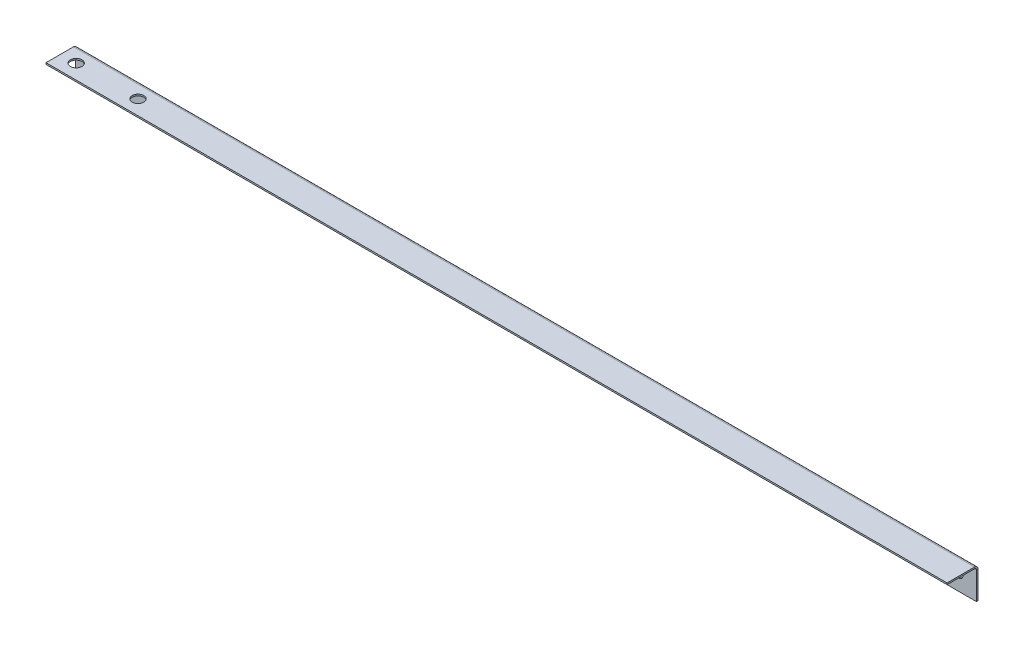
ISO-10303-21;
HEADER;
FILE_DESCRIPTION(('STEP AP214'),'2;1');
FILE_NAME('part.step','',(''),(''),'','','');
FILE_SCHEMA(('AUTOMOTIVE_DESIGN { 1 0 10303 214 1 1 1 1 }'));
ENDSEC;
DATA;
#1=APPLICATION_CONTEXT('core data for automotive mechanical design processes');
#2=APPLICATION_PROTOCOL_DEFINITION('international standard','automotive_design',2000,#1);
#3=PRODUCT_CONTEXT('',#1,'mechanical');
#4=PRODUCT('Part','Part','',(#3));
#5=PRODUCT_RELATED_PRODUCT_CATEGORY('part','',(#4));
#6=PRODUCT_DEFINITION_FORMATION('','',#4);
#7=PRODUCT_DEFINITION_CONTEXT('part definition',#1,'design');
#8=PRODUCT_DEFINITION('design','',#6,#7);
#9=PRODUCT_DEFINITION_SHAPE('','',#8);
#10=(LENGTH_UNIT() NAMED_UNIT(*) SI_UNIT(.MILLI.,.METRE.));
#11=(NAMED_UNIT(*) PLANE_ANGLE_UNIT() SI_UNIT($,.RADIAN.));
#12=(NAMED_UNIT(*) SI_UNIT($,.STERADIAN.) SOLID_ANGLE_UNIT());
#13=UNCERTAINTY_MEASURE_WITH_UNIT(LENGTH_MEASURE(1.E-05),#10,'distance_accuracy_value','');
#14=(GEOMETRIC_REPRESENTATION_CONTEXT(3) GLOBAL_UNCERTAINTY_ASSIGNED_CONTEXT((#13)) GLOBAL_UNIT_ASSIGNED_CONTEXT((#10,
#11,#12)) REPRESENTATION_CONTEXT('',''));
#15=CARTESIAN_POINT('',(0.,0.,0.));
#16=DIRECTION('',(0.,0.,1.));
#17=DIRECTION('',(1.,0.,0.));
#18=AXIS2_PLACEMENT_3D('',#15,#16,#17);
#19=CARTESIAN_POINT('',(-667.944287729196,82.8577402699223,-2.));
#20=DIRECTION('',(-1.,0.,0.));
#21=DIRECTION('',(0.,0.,1.));
#22=AXIS2_PLACEMENT_3D('',#19,#20,#21);
#23=PLANE('',#22);
#24=DIRECTION('',(0.,-1.,0.));
#25=VECTOR('',#24,1.);
#26=CARTESIAN_POINT('',(-667.944287729196,82.8577402699223,0.));
#27=LINE('',#26,#25);
#28=CARTESIAN_POINT('',(-667.944287729196,78.3577402699223,0.));
#29=VERTEX_POINT('',#28);
#30=CARTESIAN_POINT('',(-667.944287729196,42.8577402699223,0.));
#31=VERTEX_POINT('',#30);
#32=EDGE_CURVE('E308',#29,#31,#27,.T.);
#33=ORIENTED_EDGE('',*,*,#32,.F.);
#34=DIRECTION('',(0.,0.,-1.));
#35=VECTOR('',#34,1.);
#36=CARTESIAN_POINT('',(-667.944287729196,78.3577402699223,0.));
#37=LINE('',#36,#35);
#38=CARTESIAN_POINT('',(-667.944287729196,78.3577402699222,-2.));
#39=VERTEX_POINT('',#38);
#40=EDGE_CURVE('E224',#29,#39,#37,.T.);
#41=ORIENTED_EDGE('',*,*,#40,.T.);
#42=DIRECTION('',(0.,-1.,0.));
#43=VECTOR('',#42,1.);
#44=CARTESIAN_POINT('',(-667.944287729196,82.8577402699223,-2.));
#45=LINE('',#44,#43);
#46=CARTESIAN_POINT('',(-667.944287729196,42.8577402699223,-2.));
#47=VERTEX_POINT('',#46);
#48=EDGE_CURVE('E300',#39,#47,#45,.T.);
#49=ORIENTED_EDGE('',*,*,#48,.T.);
#50=DIRECTION('',(0.,0.,1.));
#51=VECTOR('',#50,1.);
#52=CARTESIAN_POINT('',(-667.944287729196,42.8577402699223,-2.));
#53=LINE('',#52,#51);
#54=EDGE_CURVE('E62',#47,#31,#53,.T.);
#55=ORIENTED_EDGE('',*,*,#54,.T.);
#56=EDGE_LOOP('',(#33,#41,#49,#55));
#57=FACE_BOUND('',#56,.T.);
#58=ADVANCED_FACE('F58',(#57),#23,.T.);
#59=CARTESIAN_POINT('',(0.,0.,-2.));
#60=DIRECTION('',(0.,0.,-1.));
#61=DIRECTION('',(-1.,0.,0.));
#62=AXIS2_PLACEMENT_3D('',#59,#60,#61);
#63=PLANE('',#62);
#64=CARTESIAN_POINT('',(374.555712270804,62.8577402699224,-2.));
#65=DIRECTION('',(0.,0.,1.));
#66=DIRECTION('',(1.,0.,0.));
#67=AXIS2_PLACEMENT_3D('',#64,#65,#66);
#68=CIRCLE('',#67,4.99999999999999);
#69=CARTESIAN_POINT('',(374.555712270804,57.8577402699224,-2.));
#70=VERTEX_POINT('',#69);
#71=CARTESIAN_POINT('',(374.555712270804,67.8577402699224,-2.));
#72=VERTEX_POINT('',#71);
#73=EDGE_CURVE('E235',#70,#72,#68,.T.);
#74=ORIENTED_EDGE('',*,*,#73,.T.);
#75=DIRECTION('',(-1.,0.,0.));
#76=VECTOR('',#75,1.);
#77=CARTESIAN_POINT('',(374.555712270804,67.8577402699224,-2.));
#78=LINE('',#77,#76);
#79=CARTESIAN_POINT('',(359.555712270804,67.8577402699224,-2.));
#80=VERTEX_POINT('',#79);
#81=EDGE_CURVE('E238',#72,#80,#78,.T.);
#82=ORIENTED_EDGE('',*,*,#81,.T.);
#83=CARTESIAN_POINT('',(359.555712270804,62.8577402699224,-2.));
#84=DIRECTION('',(0.,0.,1.));
#85=DIRECTION('',(1.,0.,0.));
#86=AXIS2_PLACEMENT_3D('',#83,#84,#85);
#87=CIRCLE('',#86,5.);
#88=CARTESIAN_POINT('',(359.555712270804,57.8577402699224,-2.));
#89=VERTEX_POINT('',#88);
#90=EDGE_CURVE('E81',#80,#89,#87,.T.);
#91=ORIENTED_EDGE('',*,*,#90,.T.);
#92=DIRECTION('',(1.,0.,0.));
#93=VECTOR('',#92,1.);
#94=CARTESIAN_POINT('',(374.555712270804,57.8577402699224,-2.));
#95=LINE('',#94,#93);
#96=EDGE_CURVE('E243',#89,#70,#95,.T.);
#97=ORIENTED_EDGE('',*,*,#96,.T.);
#98=EDGE_LOOP('',(#74,#82,#91,#97));
#99=FACE_BOUND('',#98,.T.);
#100=CARTESIAN_POINT('',(474.555712270804,62.8577402699224,-2.));
#101=DIRECTION('',(0.,0.,1.));
#102=DIRECTION('',(1.,0.,0.));
#103=AXIS2_PLACEMENT_3D('',#100,#101,#102);
#104=CIRCLE('',#103,5.);
#105=CARTESIAN_POINT('',(474.555712270804,57.8577402699224,-2.));
#106=VERTEX_POINT('',#105);
#107=CARTESIAN_POINT('',(474.555712270804,67.8577402699224,-2.));
#108=VERTEX_POINT('',#107);
#109=EDGE_CURVE('E265',#106,#108,#104,.T.);
#110=ORIENTED_EDGE('',*,*,#109,.T.);
#111=DIRECTION('',(-1.,0.,0.));
#112=VECTOR('',#111,1.);
#113=CARTESIAN_POINT('',(474.555712270804,67.8577402699224,-2.));
#114=LINE('',#113,#112);
#115=CARTESIAN_POINT('',(459.555712270804,67.8577402699224,-2.));
#116=VERTEX_POINT('',#115);
#117=EDGE_CURVE('E268',#108,#116,#114,.T.);
#118=ORIENTED_EDGE('',*,*,#117,.T.);
#119=CARTESIAN_POINT('',(459.555712270804,62.8577402699224,-2.));
#120=DIRECTION('',(0.,0.,1.));
#121=DIRECTION('',(1.,0.,0.));
#122=AXIS2_PLACEMENT_3D('',#119,#120,#121);
#123=CIRCLE('',#122,5.);
#124=CARTESIAN_POINT('',(459.555712270804,57.8577402699224,-2.));
#125=VERTEX_POINT('',#124);
#126=EDGE_CURVE('E272',#116,#125,#123,.T.);
#127=ORIENTED_EDGE('',*,*,#126,.T.);
#128=DIRECTION('',(1.,0.,0.));
#129=VECTOR('',#128,1.);
#130=CARTESIAN_POINT('',(474.555712270804,57.8577402699224,-2.));
#131=LINE('',#130,#129);
#132=EDGE_CURVE('E275',#125,#106,#131,.T.);
#133=ORIENTED_EDGE('',*,*,#132,.T.);
#134=EDGE_LOOP('',(#110,#118,#127,#133));
#135=FACE_BOUND('',#134,.T.);
#136=ORIENTED_EDGE('',*,*,#48,.F.);
#137=DIRECTION('',(-1.,0.,0.));
#138=VECTOR('',#137,1.);
#139=CARTESIAN_POINT('',(-667.944287729196,78.3577402699222,-2.));
#140=LINE('',#139,#138);
#141=CARTESIAN_POINT('',(497.055712270804,78.3577402699223,-2.));
#142=VERTEX_POINT('',#141);
#143=EDGE_CURVE('E174',#39,#142,#140,.F.);
#144=ORIENTED_EDGE('',*,*,#143,.T.);
#145=DIRECTION('',(0.,1.,0.));
#146=VECTOR('',#145,1.);
#147=CARTESIAN_POINT('',(497.055712270804,82.8577402699224,-2.));
#148=LINE('',#147,#146);
#149=CARTESIAN_POINT('',(497.055712270804,42.8577402699224,-2.));
#150=VERTEX_POINT('',#149);
#151=EDGE_CURVE('E297',#150,#142,#148,.T.);
#152=ORIENTED_EDGE('',*,*,#151,.F.);
#153=DIRECTION('',(1.,0.,0.));
#154=VECTOR('',#153,1.);
#155=CARTESIAN_POINT('',(497.055712270804,42.8577402699224,-2.));
#156=LINE('',#155,#154);
#157=EDGE_CURVE('E303',#47,#150,#156,.T.);
#158=ORIENTED_EDGE('',*,*,#157,.F.);
#159=EDGE_LOOP('',(#136,#144,#152,#158));
#160=FACE_BOUND('',#159,.T.);
#161=ADVANCED_FACE('F330',(#99,#135,#160),#63,.T.);
#162=CARTESIAN_POINT('',(0.,0.,0.));
#163=DIRECTION('',(0.,0.,-1.));
#164=DIRECTION('',(-1.,0.,0.));
#165=AXIS2_PLACEMENT_3D('',#162,#163,#164);
#166=PLANE('',#165);
#167=DIRECTION('',(-1.,0.,0.));
#168=VECTOR('',#167,1.);
#169=CARTESIAN_POINT('',(474.555712270804,67.8577402699224,0.));
#170=LINE('',#169,#168);
#171=CARTESIAN_POINT('',(474.555712270804,67.8577402699224,0.));
#172=VERTEX_POINT('',#171);
#173=CARTESIAN_POINT('',(459.555712270804,67.8577402699224,0.));
#174=VERTEX_POINT('',#173);
#175=EDGE_CURVE('E280',#172,#174,#170,.T.);
#176=ORIENTED_EDGE('',*,*,#175,.F.);
#177=CARTESIAN_POINT('',(474.555712270804,62.8577402699224,0.));
#178=DIRECTION('',(0.,0.,1.));
#179=DIRECTION('',(1.,0.,0.));
#180=AXIS2_PLACEMENT_3D('',#177,#178,#179);
#181=CIRCLE('',#180,5.);
#182=CARTESIAN_POINT('',(474.555712270804,57.8577402699224,0.));
#183=VERTEX_POINT('',#182);
#184=EDGE_CURVE('E258',#183,#172,#181,.T.);
#185=ORIENTED_EDGE('',*,*,#184,.F.);
#186=DIRECTION('',(1.,0.,0.));
#187=VECTOR('',#186,1.);
#188=CARTESIAN_POINT('',(474.555712270804,57.8577402699224,0.));
#189=LINE('',#188,#187);
#190=CARTESIAN_POINT('',(459.555712270804,57.8577402699224,0.));
#191=VERTEX_POINT('',#190);
#192=EDGE_CURVE('E269',#191,#183,#189,.T.);
#193=ORIENTED_EDGE('',*,*,#192,.F.);
#194=CARTESIAN_POINT('',(459.555712270804,62.8577402699224,0.));
#195=DIRECTION('',(0.,0.,1.));
#196=DIRECTION('',(1.,0.,0.));
#197=AXIS2_PLACEMENT_3D('',#194,#195,#196);
#198=CIRCLE('',#197,5.);
#199=EDGE_CURVE('E283',#174,#191,#198,.T.);
#200=ORIENTED_EDGE('',*,*,#199,.F.);
#201=EDGE_LOOP('',(#176,#185,#193,#200));
#202=FACE_BOUND('',#201,.T.);
#203=DIRECTION('',(-1.,0.,0.));
#204=VECTOR('',#203,1.);
#205=CARTESIAN_POINT('',(374.555712270804,67.8577402699224,0.));
#206=LINE('',#205,#204);
#207=CARTESIAN_POINT('',(374.555712270804,67.8577402699224,0.));
#208=VERTEX_POINT('',#207);
#209=CARTESIAN_POINT('',(359.555712270804,67.8577402699224,0.));
#210=VERTEX_POINT('',#209);
#211=EDGE_CURVE('E248',#208,#210,#206,.T.);
#212=ORIENTED_EDGE('',*,*,#211,.F.);
#213=CARTESIAN_POINT('',(374.555712270804,62.8577402699224,0.));
#214=DIRECTION('',(0.,0.,1.));
#215=DIRECTION('',(1.,0.,0.));
#216=AXIS2_PLACEMENT_3D('',#213,#214,#215);
#217=CIRCLE('',#216,4.99999999999999);
#218=CARTESIAN_POINT('',(374.555712270804,57.8577402699224,0.));
#219=VERTEX_POINT('',#218);
#220=EDGE_CURVE('E233',#219,#208,#217,.T.);
#221=ORIENTED_EDGE('',*,*,#220,.F.);
#222=DIRECTION('',(1.,0.,0.));
#223=VECTOR('',#222,1.);
#224=CARTESIAN_POINT('',(374.555712270804,57.8577402699224,0.));
#225=LINE('',#224,#223);
#226=CARTESIAN_POINT('',(359.555712270804,57.8577402699224,0.));
#227=VERTEX_POINT('',#226);
#228=EDGE_CURVE('E239',#227,#219,#225,.T.);
#229=ORIENTED_EDGE('',*,*,#228,.F.);
#230=CARTESIAN_POINT('',(359.555712270804,62.8577402699224,0.));
#231=DIRECTION('',(0.,0.,1.));
#232=DIRECTION('',(1.,0.,0.));
#233=AXIS2_PLACEMENT_3D('',#230,#231,#232);
#234=CIRCLE('',#233,5.);
#235=EDGE_CURVE('E251',#210,#227,#234,.T.);
#236=ORIENTED_EDGE('',*,*,#235,.F.);
#237=EDGE_LOOP('',(#212,#221,#229,#236));
#238=FACE_BOUND('',#237,.T.);
#239=DIRECTION('',(-1.,0.,0.));
#240=VECTOR('',#239,1.);
#241=CARTESIAN_POINT('',(-667.944287729196,78.3577402699223,0.));
#242=LINE('',#241,#240);
#243=CARTESIAN_POINT('',(497.055712270804,78.3577402699223,0.));
#244=VERTEX_POINT('',#243);
#245=EDGE_CURVE('E228',#29,#244,#242,.F.);
#246=ORIENTED_EDGE('',*,*,#245,.F.);
#247=ORIENTED_EDGE('',*,*,#32,.T.);
#248=DIRECTION('',(1.,0.,0.));
#249=VECTOR('',#248,1.);
#250=CARTESIAN_POINT('',(497.055712270804,42.8577402699224,0.));
#251=LINE('',#250,#249);
#252=CARTESIAN_POINT('',(497.055712270804,42.8577402699224,0.));
#253=VERTEX_POINT('',#252);
#254=EDGE_CURVE('E301',#31,#253,#251,.T.);
#255=ORIENTED_EDGE('',*,*,#254,.T.);
#256=DIRECTION('',(0.,1.,0.));
#257=VECTOR('',#256,1.);
#258=CARTESIAN_POINT('',(497.055712270804,82.8577402699224,0.));
#259=LINE('',#258,#257);
#260=EDGE_CURVE('E290',#253,#244,#259,.T.);
#261=ORIENTED_EDGE('',*,*,#260,.T.);
#262=EDGE_LOOP('',(#246,#247,#255,#261));
#263=FACE_BOUND('',#262,.T.);
#264=ADVANCED_FACE('F314',(#202,#238,#263),#166,.F.);
#265=CARTESIAN_POINT('',(497.055712270804,82.8577402699224,-2.));
#266=DIRECTION('',(1.,0.,0.));
#267=DIRECTION('',(0.,0.,-1.));
#268=AXIS2_PLACEMENT_3D('',#265,#266,#267);
#269=PLANE('',#268);
#270=DIRECTION('',(0.,0.,-1.));
#271=VECTOR('',#270,1.);
#272=CARTESIAN_POINT('',(497.055712270804,78.3577402699223,0.));
#273=LINE('',#272,#271);
#274=EDGE_CURVE('E231',#244,#142,#273,.T.);
#275=ORIENTED_EDGE('',*,*,#274,.F.);
#276=ORIENTED_EDGE('',*,*,#260,.F.);
#277=DIRECTION('',(0.,0.,1.));
#278=VECTOR('',#277,1.);
#279=CARTESIAN_POINT('',(497.055712270804,42.8577402699224,-2.));
#280=LINE('',#279,#278);
#281=EDGE_CURVE('E13',#150,#253,#280,.T.);
#282=ORIENTED_EDGE('',*,*,#281,.F.);
#283=ORIENTED_EDGE('',*,*,#151,.T.);
#284=EDGE_LOOP('',(#275,#276,#282,#283));
#285=FACE_BOUND('',#284,.T.);
#286=ADVANCED_FACE('F60',(#285),#269,.T.);
#287=CARTESIAN_POINT('',(497.055712270804,42.8577402699224,-2.));
#288=DIRECTION('',(0.,-1.,0.));
#289=DIRECTION('',(1.,0.,0.));
#290=AXIS2_PLACEMENT_3D('',#287,#288,#289);
#291=PLANE('',#290);
#292=ORIENTED_EDGE('',*,*,#254,.F.);
#293=ORIENTED_EDGE('',*,*,#54,.F.);
#294=ORIENTED_EDGE('',*,*,#157,.T.);
#295=ORIENTED_EDGE('',*,*,#281,.T.);
#296=EDGE_LOOP('',(#292,#293,#294,#295));
#297=FACE_BOUND('',#296,.T.);
#298=ADVANCED_FACE('F321',(#297),#291,.T.);
#299=CARTESIAN_POINT('',(474.555712270804,62.8577402699224,-2.));
#300=DIRECTION('',(0.,0.,1.));
#301=DIRECTION('',(1.,0.,0.));
#302=AXIS2_PLACEMENT_3D('',#299,#300,#301);
#303=CYLINDRICAL_SURFACE('',#302,5.);
#304=ORIENTED_EDGE('',*,*,#184,.T.);
#305=DIRECTION('',(0.,0.,1.));
#306=VECTOR('',#305,1.);
#307=CARTESIAN_POINT('',(474.555712270804,67.8577402699224,-2.));
#308=LINE('',#307,#306);
#309=EDGE_CURVE('E278',#108,#172,#308,.T.);
#310=ORIENTED_EDGE('',*,*,#309,.F.);
#311=ORIENTED_EDGE('',*,*,#109,.F.);
#312=DIRECTION('',(0.,0.,1.));
#313=VECTOR('',#312,1.);
#314=CARTESIAN_POINT('',(474.555712270804,57.8577402699224,-2.));
#315=LINE('',#314,#313);
#316=EDGE_CURVE('E288',#106,#183,#315,.T.);
#317=ORIENTED_EDGE('',*,*,#316,.T.);
#318=EDGE_LOOP('',(#304,#310,#311,#317));
#319=FACE_BOUND('',#318,.T.);
#320=ADVANCED_FACE('F389',(#319),#303,.F.);
#321=CARTESIAN_POINT('',(474.555712270804,57.8577402699224,-2.));
#322=DIRECTION('',(0.,-1.,0.));
#323=DIRECTION('',(1.,0.,0.));
#324=AXIS2_PLACEMENT_3D('',#321,#322,#323);
#325=PLANE('',#324);
#326=ORIENTED_EDGE('',*,*,#192,.T.);
#327=ORIENTED_EDGE('',*,*,#316,.F.);
#328=ORIENTED_EDGE('',*,*,#132,.F.);
#329=DIRECTION('',(0.,0.,1.));
#330=VECTOR('',#329,1.);
#331=CARTESIAN_POINT('',(459.555712270804,57.8577402699224,-2.));
#332=LINE('',#331,#330);
#333=EDGE_CURVE('E291',#125,#191,#332,.T.);
#334=ORIENTED_EDGE('',*,*,#333,.T.);
#335=EDGE_LOOP('',(#326,#327,#328,#334));
#336=FACE_BOUND('',#335,.T.);
#337=ADVANCED_FACE('F395',(#336),#325,.F.);
#338=CARTESIAN_POINT('',(459.555712270804,62.8577402699224,-2.));
#339=DIRECTION('',(0.,0.,1.));
#340=DIRECTION('',(1.,0.,0.));
#341=AXIS2_PLACEMENT_3D('',#338,#339,#340);
#342=CYLINDRICAL_SURFACE('',#341,5.);
#343=ORIENTED_EDGE('',*,*,#199,.T.);
#344=ORIENTED_EDGE('',*,*,#333,.F.);
#345=ORIENTED_EDGE('',*,*,#126,.F.);
#346=DIRECTION('',(0.,0.,1.));
#347=VECTOR('',#346,1.);
#348=CARTESIAN_POINT('',(459.555712270804,67.8577402699224,-2.));
#349=LINE('',#348,#347);
#350=EDGE_CURVE('E293',#116,#174,#349,.T.);
#351=ORIENTED_EDGE('',*,*,#350,.T.);
#352=EDGE_LOOP('',(#343,#344,#345,#351));
#353=FACE_BOUND('',#352,.T.);
#354=ADVANCED_FACE('F401',(#353),#342,.F.);
#355=CARTESIAN_POINT('',(474.555712270804,67.8577402699224,-2.));
#356=DIRECTION('',(0.,1.,0.));
#357=DIRECTION('',(0.,0.,1.));
#358=AXIS2_PLACEMENT_3D('',#355,#356,#357);
#359=PLANE('',#358);
#360=ORIENTED_EDGE('',*,*,#175,.T.);
#361=ORIENTED_EDGE('',*,*,#350,.F.);
#362=ORIENTED_EDGE('',*,*,#117,.F.);
#363=ORIENTED_EDGE('',*,*,#309,.T.);
#364=EDGE_LOOP('',(#360,#361,#362,#363));
#365=FACE_BOUND('',#364,.T.);
#366=ADVANCED_FACE('F397',(#365),#359,.F.);
#367=CARTESIAN_POINT('',(374.555712270804,62.8577402699224,-2.));
#368=DIRECTION('',(0.,0.,1.));
#369=DIRECTION('',(1.,0.,0.));
#370=AXIS2_PLACEMENT_3D('',#367,#368,#369);
#371=CYLINDRICAL_SURFACE('',#370,4.99999999999999);
#372=ORIENTED_EDGE('',*,*,#220,.T.);
#373=DIRECTION('',(0.,0.,1.));
#374=VECTOR('',#373,1.);
#375=CARTESIAN_POINT('',(374.555712270804,67.8577402699224,-2.));
#376=LINE('',#375,#374);
#377=EDGE_CURVE('E246',#72,#208,#376,.T.);
#378=ORIENTED_EDGE('',*,*,#377,.F.);
#379=ORIENTED_EDGE('',*,*,#73,.F.);
#380=DIRECTION('',(0.,0.,1.));
#381=VECTOR('',#380,1.);
#382=CARTESIAN_POINT('',(374.555712270804,57.8577402699224,-2.));
#383=LINE('',#382,#381);
#384=EDGE_CURVE('E256',#70,#219,#383,.T.);
#385=ORIENTED_EDGE('',*,*,#384,.T.);
#386=EDGE_LOOP('',(#372,#378,#379,#385));
#387=FACE_BOUND('',#386,.T.);
#388=ADVANCED_FACE('F400',(#387),#371,.F.);
#389=CARTESIAN_POINT('',(374.555712270804,57.8577402699224,-2.));
#390=DIRECTION('',(0.,-1.,0.));
#391=DIRECTION('',(1.,0.,0.));
#392=AXIS2_PLACEMENT_3D('',#389,#390,#391);
#393=PLANE('',#392);
#394=ORIENTED_EDGE('',*,*,#228,.T.);
#395=ORIENTED_EDGE('',*,*,#384,.F.);
#396=ORIENTED_EDGE('',*,*,#96,.F.);
#397=DIRECTION('',(0.,0.,1.));
#398=VECTOR('',#397,1.);
#399=CARTESIAN_POINT('',(359.555712270804,57.8577402699224,-2.));
#400=LINE('',#399,#398);
#401=EDGE_CURVE('E259',#89,#227,#400,.T.);
#402=ORIENTED_EDGE('',*,*,#401,.T.);
#403=EDGE_LOOP('',(#394,#395,#396,#402));
#404=FACE_BOUND('',#403,.T.);
#405=ADVANCED_FACE('F411',(#404),#393,.F.);
#406=CARTESIAN_POINT('',(359.555712270804,62.8577402699224,-2.));
#407=DIRECTION('',(0.,0.,1.));
#408=DIRECTION('',(1.,0.,0.));
#409=AXIS2_PLACEMENT_3D('',#406,#407,#408);
#410=CYLINDRICAL_SURFACE('',#409,5.);
#411=ORIENTED_EDGE('',*,*,#235,.T.);
#412=ORIENTED_EDGE('',*,*,#401,.F.);
#413=ORIENTED_EDGE('',*,*,#90,.F.);
#414=DIRECTION('',(0.,0.,1.));
#415=VECTOR('',#414,1.);
#416=CARTESIAN_POINT('',(359.555712270804,67.8577402699224,-2.));
#417=LINE('',#416,#415);
#418=EDGE_CURVE('E261',#80,#210,#417,.T.);
#419=ORIENTED_EDGE('',*,*,#418,.T.);
#420=EDGE_LOOP('',(#411,#412,#413,#419));
#421=FACE_BOUND('',#420,.T.);
#422=ADVANCED_FACE('F416',(#421),#410,.F.);
#423=CARTESIAN_POINT('',(374.555712270804,67.8577402699224,-2.));
#424=DIRECTION('',(0.,1.,0.));
#425=DIRECTION('',(0.,0.,1.));
#426=AXIS2_PLACEMENT_3D('',#423,#424,#425);
#427=PLANE('',#426);
#428=ORIENTED_EDGE('',*,*,#211,.T.);
#429=ORIENTED_EDGE('',*,*,#418,.F.);
#430=ORIENTED_EDGE('',*,*,#81,.F.);
#431=ORIENTED_EDGE('',*,*,#377,.T.);
#432=EDGE_LOOP('',(#428,#429,#430,#431));
#433=FACE_BOUND('',#432,.T.);
#434=ADVANCED_FACE('F413',(#433),#427,.F.);
#435=CARTESIAN_POINT('',(497.055712270804,78.3577402699224,2.49999999999997));
#436=DIRECTION('',(1.,0.,0.));
#437=DIRECTION('',(0.,0.,-1.));
#438=AXIS2_PLACEMENT_3D('',#435,#436,#437);
#439=PLANE('',#438);
#440=DIRECTION('',(0.,1.,0.));
#441=VECTOR('',#440,1.);
#442=CARTESIAN_POINT('',(497.055712270804,82.8577402699224,2.49999999999998));
#443=LINE('',#442,#441);
#444=CARTESIAN_POINT('',(497.055712270804,80.8577402699224,2.49999999999997));
#445=VERTEX_POINT('',#444);
#446=CARTESIAN_POINT('',(497.055712270804,82.8577402699224,2.49999999999996));
#447=VERTEX_POINT('',#446);
#448=EDGE_CURVE('E219',#445,#447,#443,.T.);
#449=ORIENTED_EDGE('',*,*,#448,.F.);
#450=CARTESIAN_POINT('',(497.055712270804,78.3577402699224,2.49999999999997));
#451=DIRECTION('',(-1.,0.,0.));
#452=DIRECTION('',(0.,0.,1.));
#453=AXIS2_PLACEMENT_3D('',#450,#451,#452);
#454=CIRCLE('',#453,2.50000000000007);
#455=EDGE_CURVE('E177',#244,#445,#454,.F.);
#456=ORIENTED_EDGE('',*,*,#455,.F.);
#457=ORIENTED_EDGE('',*,*,#274,.T.);
#458=CARTESIAN_POINT('',(497.055712270804,78.3577402699224,2.49999999999997));
#459=DIRECTION('',(-1.,0.,0.));
#460=DIRECTION('',(0.,0.,1.));
#461=AXIS2_PLACEMENT_3D('',#458,#459,#460);
#462=CIRCLE('',#461,4.50000000000007);
#463=EDGE_CURVE('E73',#142,#447,#462,.F.);
#464=ORIENTED_EDGE('',*,*,#463,.T.);
#465=EDGE_LOOP('',(#449,#456,#457,#464));
#466=FACE_BOUND('',#465,.T.);
#467=ADVANCED_FACE('F327',(#466),#439,.T.);
#468=CARTESIAN_POINT('',(-667.944287729196,78.3577402699224,2.50000000000008));
#469=DIRECTION('',(1.,0.,0.));
#470=DIRECTION('',(0.,0.,-1.));
#471=AXIS2_PLACEMENT_3D('',#468,#469,#470);
#472=PLANE('',#471);
#473=CARTESIAN_POINT('',(-667.944287729196,78.3577402699224,2.50000000000008));
#474=DIRECTION('',(-1.,0.,0.));
#475=DIRECTION('',(0.,0.,1.));
#476=AXIS2_PLACEMENT_3D('',#473,#474,#475);
#477=CIRCLE('',#476,2.50000000000007);
#478=CARTESIAN_POINT('',(-667.944287729196,80.8577402699224,2.50000000000007));
#479=VERTEX_POINT('',#478);
#480=EDGE_CURVE('E184',#479,#29,#477,.T.);
#481=ORIENTED_EDGE('',*,*,#480,.F.);
#482=DIRECTION('',(0.,1.,0.));
#483=VECTOR('',#482,1.);
#484=CARTESIAN_POINT('',(-667.944287729196,80.8577402699223,2.50000000000004));
#485=LINE('',#484,#483);
#486=CARTESIAN_POINT('',(-667.944287729196,82.8577402699223,2.50000000000004));
#487=VERTEX_POINT('',#486);
#488=EDGE_CURVE('E181',#479,#487,#485,.T.);
#489=ORIENTED_EDGE('',*,*,#488,.T.);
#490=CARTESIAN_POINT('',(-667.944287729196,78.3577402699224,2.50000000000008));
#491=DIRECTION('',(-1.,0.,0.));
#492=DIRECTION('',(0.,0.,1.));
#493=AXIS2_PLACEMENT_3D('',#490,#491,#492);
#494=CIRCLE('',#493,4.50000000000007);
#495=EDGE_CURVE('E168',#487,#39,#494,.T.);
#496=ORIENTED_EDGE('',*,*,#495,.T.);
#497=ORIENTED_EDGE('',*,*,#40,.F.);
#498=EDGE_LOOP('',(#481,#489,#496,#497));
#499=FACE_BOUND('',#498,.T.);
#500=ADVANCED_FACE('F182',(#499),#472,.F.);
#501=CARTESIAN_POINT('',(-667.944287729196,78.3577402699224,2.50000000000008));
#502=DIRECTION('',(-1.,0.,0.));
#503=DIRECTION('',(0.,1.,0.));
#504=AXIS2_PLACEMENT_3D('',#501,#502,#503);
#505=CYLINDRICAL_SURFACE('',#504,4.50000000000007);
#506=ORIENTED_EDGE('',*,*,#143,.F.);
#507=ORIENTED_EDGE('',*,*,#495,.F.);
#508=DIRECTION('',(-1.,0.,0.));
#509=VECTOR('',#508,1.);
#510=CARTESIAN_POINT('',(0.,82.8577402699224,2.5));
#511=LINE('',#510,#509);
#512=EDGE_CURVE('E172',#447,#487,#511,.T.);
#513=ORIENTED_EDGE('',*,*,#512,.F.);
#514=ORIENTED_EDGE('',*,*,#463,.F.);
#515=EDGE_LOOP('',(#506,#507,#513,#514));
#516=FACE_BOUND('',#515,.T.);
#517=ADVANCED_FACE('F170',(#516),#505,.T.);
#518=CARTESIAN_POINT('',(-667.944287729196,78.3577402699224,2.50000000000008));
#519=DIRECTION('',(-1.,0.,0.));
#520=DIRECTION('',(0.,1.,0.));
#521=AXIS2_PLACEMENT_3D('',#518,#519,#520);
#522=CYLINDRICAL_SURFACE('',#521,2.50000000000007);
#523=ORIENTED_EDGE('',*,*,#245,.T.);
#524=ORIENTED_EDGE('',*,*,#455,.T.);
#525=DIRECTION('',(1.,0.,0.));
#526=VECTOR('',#525,1.);
#527=CARTESIAN_POINT('',(497.055712270804,80.8577402699224,2.49999999999999));
#528=LINE('',#527,#526);
#529=EDGE_CURVE('E189',#445,#479,#528,.F.);
#530=ORIENTED_EDGE('',*,*,#529,.T.);
#531=ORIENTED_EDGE('',*,*,#480,.T.);
#532=EDGE_LOOP('',(#523,#524,#530,#531));
#533=FACE_BOUND('',#532,.T.);
#534=ADVANCED_FACE('F333',(#533),#522,.F.);
#535=CARTESIAN_POINT('',(-667.944287729196,82.8577402699223,0.));
#536=DIRECTION('',(-1.,0.,0.));
#537=DIRECTION('',(0.,-1.,0.));
#538=AXIS2_PLACEMENT_3D('',#535,#536,#537);
#539=PLANE('',#538);
#540=DIRECTION('',(0.,0.,-1.));
#541=VECTOR('',#540,1.);
#542=CARTESIAN_POINT('',(-667.944287729196,82.8577402699223,0.));
#543=LINE('',#542,#541);
#544=CARTESIAN_POINT('',(-667.944287729196,82.8577402699224,38.));
#545=VERTEX_POINT('',#544);
#546=EDGE_CURVE('E196',#545,#487,#543,.T.);
#547=ORIENTED_EDGE('',*,*,#546,.T.);
#548=ORIENTED_EDGE('',*,*,#488,.F.);
#549=DIRECTION('',(0.,0.,1.));
#550=VECTOR('',#549,1.);
#551=CARTESIAN_POINT('',(-667.944287729196,80.8577402699223,-3.02600562552891E-13));
#552=LINE('',#551,#550);
#553=CARTESIAN_POINT('',(-667.944287729196,80.8577402699224,38.));
#554=VERTEX_POINT('',#553);
#555=EDGE_CURVE('E212',#554,#479,#552,.F.);
#556=ORIENTED_EDGE('',*,*,#555,.F.);
#557=DIRECTION('',(0.,-1.,0.));
#558=VECTOR('',#557,1.);
#559=CARTESIAN_POINT('',(-667.944287729196,82.8577402699224,38.));
#560=LINE('',#559,#558);
#561=EDGE_CURVE('E201',#545,#554,#560,.T.);
#562=ORIENTED_EDGE('',*,*,#561,.F.);
#563=EDGE_LOOP('',(#547,#548,#556,#562));
#564=FACE_BOUND('',#563,.T.);
#565=ADVANCED_FACE('F200',(#564),#539,.T.);
#566=CARTESIAN_POINT('',(497.055712270804,82.8577402699226,38.));
#567=DIRECTION('',(1.,0.,0.));
#568=DIRECTION('',(0.,1.,0.));
#569=AXIS2_PLACEMENT_3D('',#566,#567,#568);
#570=PLANE('',#569);
#571=DIRECTION('',(0.,0.,-1.));
#572=VECTOR('',#571,1.);
#573=CARTESIAN_POINT('',(497.055712270804,80.8577402699224,-3.02600562552891E-13));
#574=LINE('',#573,#572);
#575=CARTESIAN_POINT('',(497.055712270804,80.8577402699226,38.));
#576=VERTEX_POINT('',#575);
#577=EDGE_CURVE('E198',#445,#576,#574,.F.);
#578=ORIENTED_EDGE('',*,*,#577,.F.);
#579=ORIENTED_EDGE('',*,*,#448,.T.);
#580=DIRECTION('',(0.,0.,1.));
#581=VECTOR('',#580,1.);
#582=CARTESIAN_POINT('',(497.055712270804,82.8577402699226,38.));
#583=LINE('',#582,#581);
#584=CARTESIAN_POINT('',(497.055712270804,82.8577402699226,38.));
#585=VERTEX_POINT('',#584);
#586=EDGE_CURVE('E197',#447,#585,#583,.T.);
#587=ORIENTED_EDGE('',*,*,#586,.T.);
#588=DIRECTION('',(0.,-1.,0.));
#589=VECTOR('',#588,1.);
#590=CARTESIAN_POINT('',(497.055712270804,82.8577402699226,38.));
#591=LINE('',#590,#589);
#592=EDGE_CURVE('E203',#585,#576,#591,.T.);
#593=ORIENTED_EDGE('',*,*,#592,.T.);
#594=EDGE_LOOP('',(#578,#579,#587,#593));
#595=FACE_BOUND('',#594,.T.);
#596=ADVANCED_FACE('F339',(#595),#570,.T.);
#597=CARTESIAN_POINT('',(0.,82.8577402699224,-3.09583525230577E-13));
#598=DIRECTION('',(0.,1.,0.));
#599=DIRECTION('',(0.,0.,1.));
#600=AXIS2_PLACEMENT_3D('',#597,#598,#599);
#601=PLANE('',#600);
#602=CARTESIAN_POINT('',(-567.944287729196,82.8577402699227,19.));
#603=DIRECTION('',(0.,-1.,0.));
#604=DIRECTION('',(0.,0.,-1.));
#605=AXIS2_PLACEMENT_3D('',#602,#603,#604);
#606=CIRCLE('',#605,7.49999999999995);
#607=CARTESIAN_POINT('',(-567.944287729196,82.8577402699226,11.5));
#608=VERTEX_POINT('',#607);
#609=EDGE_CURVE('E348',#608,#608,#606,.T.);
#610=ORIENTED_EDGE('',*,*,#609,.T.);
#611=EDGE_LOOP('',(#610));
#612=FACE_BOUND('',#611,.T.);
#613=CARTESIAN_POINT('',(-647.944287729196,82.8577402699226,19.));
#614=DIRECTION('',(0.,-1.,0.));
#615=DIRECTION('',(0.,0.,-1.));
#616=AXIS2_PLACEMENT_3D('',#613,#614,#615);
#617=CIRCLE('',#616,7.49999999999995);
#618=CARTESIAN_POINT('',(-647.944287729196,82.8577402699226,11.5));
#619=VERTEX_POINT('',#618);
#620=EDGE_CURVE('E222',#619,#619,#617,.T.);
#621=ORIENTED_EDGE('',*,*,#620,.T.);
#622=EDGE_LOOP('',(#621));
#623=FACE_BOUND('',#622,.T.);
#624=ORIENTED_EDGE('',*,*,#586,.F.);
#625=ORIENTED_EDGE('',*,*,#512,.T.);
#626=ORIENTED_EDGE('',*,*,#546,.F.);
#627=DIRECTION('',(-1.,0.,0.));
#628=VECTOR('',#627,1.);
#629=CARTESIAN_POINT('',(-667.944287729196,82.8577402699224,38.));
#630=LINE('',#629,#628);
#631=EDGE_CURVE('E204',#585,#545,#630,.T.);
#632=ORIENTED_EDGE('',*,*,#631,.F.);
#633=EDGE_LOOP('',(#624,#625,#626,#632));
#634=FACE_BOUND('',#633,.T.);
#635=ADVANCED_FACE('F194',(#612,#623,#634),#601,.T.);
#636=CARTESIAN_POINT('',(0.,80.8577402699224,-3.02600562552891E-13));
#637=DIRECTION('',(0.,1.,0.));
#638=DIRECTION('',(0.,0.,1.));
#639=AXIS2_PLACEMENT_3D('',#636,#637,#638);
#640=PLANE('',#639);
#641=CARTESIAN_POINT('',(-567.944287729196,80.8577402699224,19.));
#642=DIRECTION('',(0.,-1.,0.));
#643=DIRECTION('',(0.,0.,-1.));
#644=AXIS2_PLACEMENT_3D('',#641,#642,#643);
#645=CIRCLE('',#644,7.49999999999995);
#646=CARTESIAN_POINT('',(-567.944287729196,80.8577402699223,11.5000000000001));
#647=VERTEX_POINT('',#646);
#648=EDGE_CURVE('E351',#647,#647,#645,.T.);
#649=ORIENTED_EDGE('',*,*,#648,.F.);
#650=EDGE_LOOP('',(#649));
#651=FACE_BOUND('',#650,.T.);
#652=CARTESIAN_POINT('',(-647.944287729196,80.8577402699223,19.));
#653=DIRECTION('',(0.,-1.,0.));
#654=DIRECTION('',(0.,0.,-1.));
#655=AXIS2_PLACEMENT_3D('',#652,#653,#654);
#656=CIRCLE('',#655,7.49999999999995);
#657=CARTESIAN_POINT('',(-647.944287729196,80.8577402699223,11.5000000000001));
#658=VERTEX_POINT('',#657);
#659=EDGE_CURVE('E345',#658,#658,#656,.T.);
#660=ORIENTED_EDGE('',*,*,#659,.F.);
#661=EDGE_LOOP('',(#660));
#662=FACE_BOUND('',#661,.T.);
#663=ORIENTED_EDGE('',*,*,#529,.F.);
#664=ORIENTED_EDGE('',*,*,#577,.T.);
#665=DIRECTION('',(1.,0.,0.));
#666=VECTOR('',#665,1.);
#667=CARTESIAN_POINT('',(0.,80.8577402699225,38.));
#668=LINE('',#667,#666);
#669=EDGE_CURVE('E214',#576,#554,#668,.F.);
#670=ORIENTED_EDGE('',*,*,#669,.T.);
#671=ORIENTED_EDGE('',*,*,#555,.T.);
#672=EDGE_LOOP('',(#663,#664,#670,#671));
#673=FACE_BOUND('',#672,.T.);
#674=ADVANCED_FACE('F337',(#651,#662,#673),#640,.F.);
#675=CARTESIAN_POINT('',(-667.944287729196,82.8577402699224,38.));
#676=DIRECTION('',(0.,0.,1.));
#677=DIRECTION('',(0.,-1.,0.));
#678=AXIS2_PLACEMENT_3D('',#675,#676,#677);
#679=PLANE('',#678);
#680=ORIENTED_EDGE('',*,*,#669,.F.);
#681=ORIENTED_EDGE('',*,*,#592,.F.);
#682=ORIENTED_EDGE('',*,*,#631,.T.);
#683=ORIENTED_EDGE('',*,*,#561,.T.);
#684=EDGE_LOOP('',(#680,#681,#682,#683));
#685=FACE_BOUND('',#684,.T.);
#686=ADVANCED_FACE('F343',(#685),#679,.T.);
#687=CARTESIAN_POINT('',(-647.944287729196,82.8577402699226,19.));
#688=DIRECTION('',(0.,-1.,0.));
#689=DIRECTION('',(0.,0.,-1.));
#690=AXIS2_PLACEMENT_3D('',#687,#688,#689);
#691=CYLINDRICAL_SURFACE('',#690,7.49999999999995);
#692=ORIENTED_EDGE('',*,*,#620,.F.);
#693=EDGE_LOOP('',(#692));
#694=FACE_BOUND('',#693,.T.);
#695=ORIENTED_EDGE('',*,*,#659,.T.);
#696=EDGE_LOOP('',(#695));
#697=FACE_BOUND('',#696,.T.);
#698=ADVANCED_FACE('F362',(#694,#697),#691,.F.);
#699=CARTESIAN_POINT('',(-567.944287729196,82.8577402699227,19.));
#700=DIRECTION('',(0.,-1.,0.));
#701=DIRECTION('',(0.,0.,-1.));
#702=AXIS2_PLACEMENT_3D('',#699,#700,#701);
#703=CYLINDRICAL_SURFACE('',#702,7.49999999999995);
#704=ORIENTED_EDGE('',*,*,#609,.F.);
#705=EDGE_LOOP('',(#704));
#706=FACE_BOUND('',#705,.T.);
#707=ORIENTED_EDGE('',*,*,#648,.T.);
#708=EDGE_LOOP('',(#707));
#709=FACE_BOUND('',#708,.T.);
#710=ADVANCED_FACE('F359',(#706,#709),#703,.F.);
#711=CLOSED_SHELL('',(#58,#161,#264,#286,#298,#320,#337,#354,#366,#388,#405,#422,#434,#467,#500,
#517,#534,#565,#596,#635,#674,#686,#698,#710));
#712=MANIFOLD_SOLID_BREP('B2',#711);
#713=ADVANCED_BREP_SHAPE_REPRESENTATION('',(#18,#712),#14);
#714=SHAPE_DEFINITION_REPRESENTATION(#9,#713);
ENDSEC;
END-ISO-10303-21;
